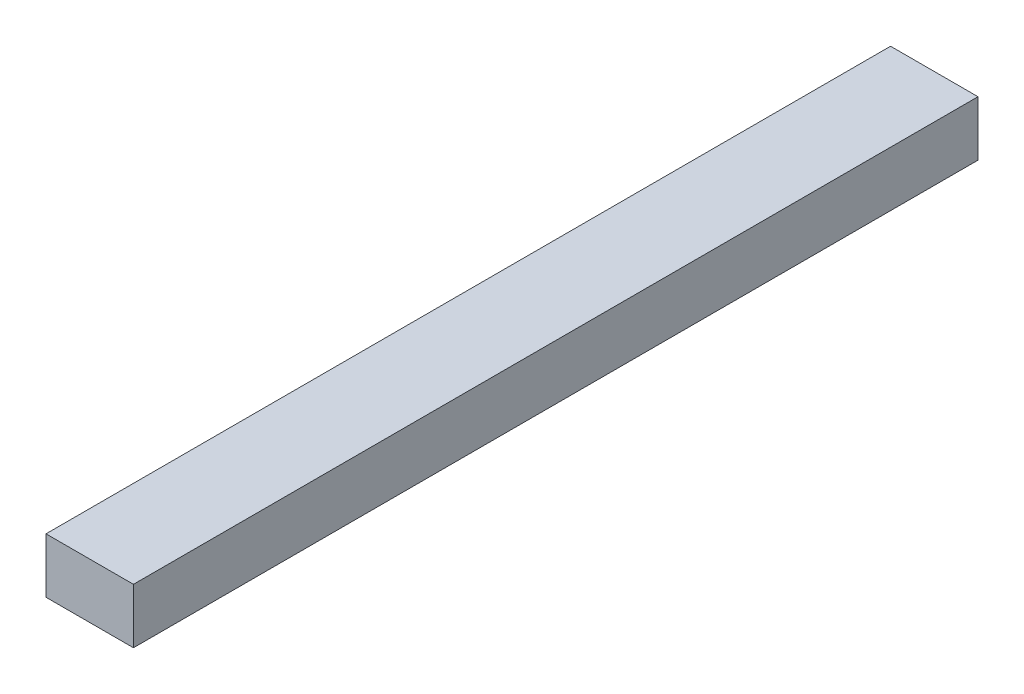
ISO-10303-21;
HEADER;
FILE_DESCRIPTION(('STEP AP214'),'2;1');
FILE_NAME('part.step','',(''),(''),'','','');
FILE_SCHEMA(('AUTOMOTIVE_DESIGN { 1 0 10303 214 1 1 1 1 }'));
ENDSEC;
DATA;
#1=APPLICATION_CONTEXT('core data for automotive mechanical design processes');
#2=APPLICATION_PROTOCOL_DEFINITION('international standard','automotive_design',2000,#1);
#3=PRODUCT_CONTEXT('',#1,'mechanical');
#4=PRODUCT('Part','Part','',(#3));
#5=PRODUCT_RELATED_PRODUCT_CATEGORY('part','',(#4));
#6=PRODUCT_DEFINITION_FORMATION('','',#4);
#7=PRODUCT_DEFINITION_CONTEXT('part definition',#1,'design');
#8=PRODUCT_DEFINITION('design','',#6,#7);
#9=PRODUCT_DEFINITION_SHAPE('','',#8);
#10=(LENGTH_UNIT() NAMED_UNIT(*) SI_UNIT(.MILLI.,.METRE.));
#11=(NAMED_UNIT(*) PLANE_ANGLE_UNIT() SI_UNIT($,.RADIAN.));
#12=(NAMED_UNIT(*) SI_UNIT($,.STERADIAN.) SOLID_ANGLE_UNIT());
#13=UNCERTAINTY_MEASURE_WITH_UNIT(LENGTH_MEASURE(1.E-05),#10,'distance_accuracy_value','');
#14=(GEOMETRIC_REPRESENTATION_CONTEXT(3) GLOBAL_UNCERTAINTY_ASSIGNED_CONTEXT((#13)) GLOBAL_UNIT_ASSIGNED_CONTEXT((#10,
#11,#12)) REPRESENTATION_CONTEXT('',''));
#15=CARTESIAN_POINT('',(0.,0.,0.));
#16=DIRECTION('',(0.,0.,1.));
#17=DIRECTION('',(1.,0.,0.));
#18=AXIS2_PLACEMENT_3D('',#15,#16,#17);
#19=CARTESIAN_POINT('',(34.9999999999997,-21.9999999999996,-338.));
#20=DIRECTION('',(0.,0.,-1.));
#21=DIRECTION('',(0.,-1.,0.));
#22=AXIS2_PLACEMENT_3D('',#19,#20,#21);
#23=PLANE('',#22);
#24=DIRECTION('',(0.,1.,0.));
#25=VECTOR('',#24,1.);
#26=CARTESIAN_POINT('',(35.,-21.9999999999999,-338.));
#27=LINE('',#26,#25);
#28=CARTESIAN_POINT('',(35.,-21.9999999999999,-338.));
#29=VERTEX_POINT('',#28);
#30=CARTESIAN_POINT('',(35.,22.0000000000001,-338.));
#31=VERTEX_POINT('',#30);
#32=EDGE_CURVE('E38',#29,#31,#27,.T.);
#33=ORIENTED_EDGE('',*,*,#32,.F.);
#34=DIRECTION('',(1.,0.,0.));
#35=VECTOR('',#34,1.);
#36=CARTESIAN_POINT('',(-35.,-21.9999999999999,-338.));
#37=LINE('',#36,#35);
#38=CARTESIAN_POINT('',(-35.,-22.,-338.));
#39=VERTEX_POINT('',#38);
#40=EDGE_CURVE('E100',#39,#29,#37,.T.);
#41=ORIENTED_EDGE('',*,*,#40,.F.);
#42=DIRECTION('',(0.,-1.,0.));
#43=VECTOR('',#42,1.);
#44=CARTESIAN_POINT('',(-35.,-21.9999999999999,-338.));
#45=LINE('',#44,#43);
#46=CARTESIAN_POINT('',(-35.,22.0000000000001,-338.));
#47=VERTEX_POINT('',#46);
#48=EDGE_CURVE('E51',#47,#39,#45,.T.);
#49=ORIENTED_EDGE('',*,*,#48,.F.);
#50=DIRECTION('',(-1.,0.,0.));
#51=VECTOR('',#50,1.);
#52=CARTESIAN_POINT('',(-35.,22.0000000000001,-338.));
#53=LINE('',#52,#51);
#54=EDGE_CURVE('E45',#31,#47,#53,.T.);
#55=ORIENTED_EDGE('',*,*,#54,.F.);
#56=EDGE_LOOP('',(#33,#41,#49,#55));
#57=FACE_BOUND('',#56,.T.);
#58=ADVANCED_FACE('F31',(#57),#23,.T.);
#59=CARTESIAN_POINT('',(-35.,22.0000000000001,-420.680106434377));
#60=DIRECTION('',(0.,1.,0.));
#61=DIRECTION('',(0.,0.,1.));
#62=AXIS2_PLACEMENT_3D('',#59,#60,#61);
#63=PLANE('',#62);
#64=DIRECTION('',(0.,0.,1.));
#65=VECTOR('',#64,1.);
#66=CARTESIAN_POINT('',(35.,22.0000000000001,-420.680106434377));
#67=LINE('',#66,#65);
#68=CARTESIAN_POINT('',(35.,21.9999999999999,338.));
#69=VERTEX_POINT('',#68);
#70=EDGE_CURVE('E11',#31,#69,#67,.T.);
#71=ORIENTED_EDGE('',*,*,#70,.F.);
#72=ORIENTED_EDGE('',*,*,#54,.T.);
#73=DIRECTION('',(0.,0.,1.));
#74=VECTOR('',#73,1.);
#75=CARTESIAN_POINT('',(-35.,22.0000000000001,-420.680106434377));
#76=LINE('',#75,#74);
#77=CARTESIAN_POINT('',(-35.,21.9999999999999,338.));
#78=VERTEX_POINT('',#77);
#79=EDGE_CURVE('E87',#47,#78,#76,.T.);
#80=ORIENTED_EDGE('',*,*,#79,.T.);
#81=DIRECTION('',(-1.,0.,0.));
#82=VECTOR('',#81,1.);
#83=CARTESIAN_POINT('',(-35.,21.9999999999999,338.));
#84=LINE('',#83,#82);
#85=EDGE_CURVE('E85',#69,#78,#84,.T.);
#86=ORIENTED_EDGE('',*,*,#85,.F.);
#87=EDGE_LOOP('',(#71,#72,#80,#86));
#88=FACE_BOUND('',#87,.T.);
#89=ADVANCED_FACE('F86',(#88),#63,.T.);
#90=CARTESIAN_POINT('',(-35.,-21.9999999999999,-420.680106434377));
#91=DIRECTION('',(-1.,0.,0.));
#92=DIRECTION('',(0.,0.,1.));
#93=AXIS2_PLACEMENT_3D('',#90,#91,#92);
#94=PLANE('',#93);
#95=ORIENTED_EDGE('',*,*,#79,.F.);
#96=ORIENTED_EDGE('',*,*,#48,.T.);
#97=DIRECTION('',(0.,0.,1.));
#98=VECTOR('',#97,1.);
#99=CARTESIAN_POINT('',(-35.,-21.9999999999999,-420.680106434377));
#100=LINE('',#99,#98);
#101=CARTESIAN_POINT('',(-35.,-22.0000000000001,338.));
#102=VERTEX_POINT('',#101);
#103=EDGE_CURVE('E72',#39,#102,#100,.T.);
#104=ORIENTED_EDGE('',*,*,#103,.T.);
#105=DIRECTION('',(0.,-1.,0.));
#106=VECTOR('',#105,1.);
#107=CARTESIAN_POINT('',(-35.,-22.0000000000001,338.));
#108=LINE('',#107,#106);
#109=EDGE_CURVE('E90',#78,#102,#108,.T.);
#110=ORIENTED_EDGE('',*,*,#109,.F.);
#111=EDGE_LOOP('',(#95,#96,#104,#110));
#112=FACE_BOUND('',#111,.T.);
#113=ADVANCED_FACE('F104',(#112),#94,.T.);
#114=CARTESIAN_POINT('',(-35.,-21.9999999999999,-420.680106434377));
#115=DIRECTION('',(0.,-1.,0.));
#116=DIRECTION('',(0.,0.,-1.));
#117=AXIS2_PLACEMENT_3D('',#114,#115,#116);
#118=PLANE('',#117);
#119=ORIENTED_EDGE('',*,*,#103,.F.);
#120=ORIENTED_EDGE('',*,*,#40,.T.);
#121=DIRECTION('',(0.,0.,1.));
#122=VECTOR('',#121,1.);
#123=CARTESIAN_POINT('',(35.,-21.9999999999999,-420.680106434377));
#124=LINE('',#123,#122);
#125=CARTESIAN_POINT('',(35.,-22.0000000000001,338.));
#126=VERTEX_POINT('',#125);
#127=EDGE_CURVE('E64',#29,#126,#124,.T.);
#128=ORIENTED_EDGE('',*,*,#127,.T.);
#129=DIRECTION('',(1.,0.,0.));
#130=VECTOR('',#129,1.);
#131=CARTESIAN_POINT('',(-35.,-22.0000000000001,338.));
#132=LINE('',#131,#130);
#133=EDGE_CURVE('E93',#102,#126,#132,.T.);
#134=ORIENTED_EDGE('',*,*,#133,.F.);
#135=EDGE_LOOP('',(#119,#120,#128,#134));
#136=FACE_BOUND('',#135,.T.);
#137=ADVANCED_FACE('F106',(#136),#118,.T.);
#138=CARTESIAN_POINT('',(35.,-21.9999999999999,-420.680106434377));
#139=DIRECTION('',(1.,0.,0.));
#140=DIRECTION('',(0.,0.,-1.));
#141=AXIS2_PLACEMENT_3D('',#138,#139,#140);
#142=PLANE('',#141);
#143=ORIENTED_EDGE('',*,*,#127,.F.);
#144=ORIENTED_EDGE('',*,*,#32,.T.);
#145=ORIENTED_EDGE('',*,*,#70,.T.);
#146=DIRECTION('',(0.,1.,0.));
#147=VECTOR('',#146,1.);
#148=CARTESIAN_POINT('',(35.,-22.0000000000001,338.));
#149=LINE('',#148,#147);
#150=EDGE_CURVE('E81',#126,#69,#149,.T.);
#151=ORIENTED_EDGE('',*,*,#150,.F.);
#152=EDGE_LOOP('',(#143,#144,#145,#151));
#153=FACE_BOUND('',#152,.T.);
#154=ADVANCED_FACE('F79',(#153),#142,.T.);
#155=CARTESIAN_POINT('',(-35.0000000000005,-1222.,338.));
#156=DIRECTION('',(0.,0.,1.));
#157=DIRECTION('',(0.,-1.,0.));
#158=AXIS2_PLACEMENT_3D('',#155,#156,#157);
#159=PLANE('',#158);
#160=ORIENTED_EDGE('',*,*,#133,.T.);
#161=ORIENTED_EDGE('',*,*,#150,.T.);
#162=ORIENTED_EDGE('',*,*,#85,.T.);
#163=ORIENTED_EDGE('',*,*,#109,.T.);
#164=EDGE_LOOP('',(#160,#161,#162,#163));
#165=FACE_BOUND('',#164,.T.);
#166=ADVANCED_FACE('F92',(#165),#159,.T.);
#167=CLOSED_SHELL('',(#58,#89,#113,#137,#154,#166));
#168=MANIFOLD_SOLID_BREP('B2',#167);
#169=ADVANCED_BREP_SHAPE_REPRESENTATION('',(#18,#168),#14);
#170=SHAPE_DEFINITION_REPRESENTATION(#9,#169);
ENDSEC;
END-ISO-10303-21;
